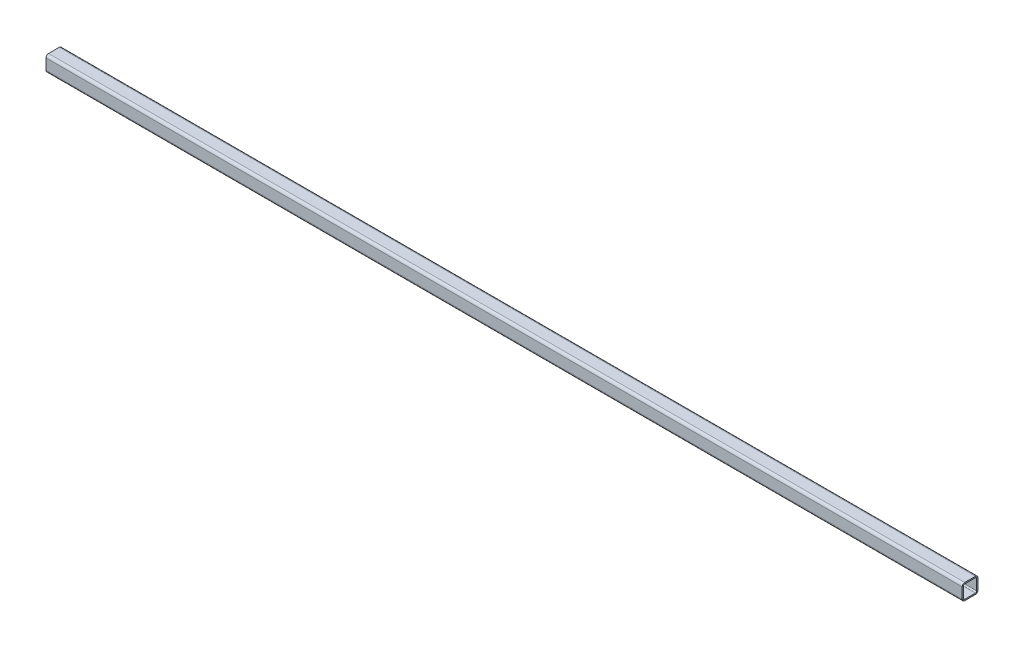
ISO-10303-21;
HEADER;
FILE_DESCRIPTION(('STEP AP214'),'2;1');
FILE_NAME('part.step','',(''),(''),'','','');
FILE_SCHEMA(('AUTOMOTIVE_DESIGN { 1 0 10303 214 1 1 1 1 }'));
ENDSEC;
DATA;
#1=APPLICATION_CONTEXT('core data for automotive mechanical design processes');
#2=APPLICATION_PROTOCOL_DEFINITION('international standard','automotive_design',2000,#1);
#3=PRODUCT_CONTEXT('',#1,'mechanical');
#4=PRODUCT('Part','Part','',(#3));
#5=PRODUCT_RELATED_PRODUCT_CATEGORY('part','',(#4));
#6=PRODUCT_DEFINITION_FORMATION('','',#4);
#7=PRODUCT_DEFINITION_CONTEXT('part definition',#1,'design');
#8=PRODUCT_DEFINITION('design','',#6,#7);
#9=PRODUCT_DEFINITION_SHAPE('','',#8);
#10=(LENGTH_UNIT() NAMED_UNIT(*) SI_UNIT(.MILLI.,.METRE.));
#11=(NAMED_UNIT(*) PLANE_ANGLE_UNIT() SI_UNIT($,.RADIAN.));
#12=(NAMED_UNIT(*) SI_UNIT($,.STERADIAN.) SOLID_ANGLE_UNIT());
#13=UNCERTAINTY_MEASURE_WITH_UNIT(LENGTH_MEASURE(1.E-05),#10,'distance_accuracy_value','');
#14=(GEOMETRIC_REPRESENTATION_CONTEXT(3) GLOBAL_UNCERTAINTY_ASSIGNED_CONTEXT((#13)) GLOBAL_UNIT_ASSIGNED_CONTEXT((#10,
#11,#12)) REPRESENTATION_CONTEXT('',''));
#15=CARTESIAN_POINT('',(0.,0.,0.));
#16=DIRECTION('',(0.,0.,1.));
#17=DIRECTION('',(1.,0.,0.));
#18=AXIS2_PLACEMENT_3D('',#15,#16,#17);
#19=CARTESIAN_POINT('',(-1180.,1563.6,-893.6));
#20=DIRECTION('',(1.,0.,0.));
#21=DIRECTION('',(0.,0.,-1.));
#22=AXIS2_PLACEMENT_3D('',#19,#20,#21);
#23=CYLINDRICAL_SURFACE('',#22,6.39999999999996);
#24=CARTESIAN_POINT('',(-1160.,1563.6,-893.6));
#25=DIRECTION('',(1.,0.,0.));
#26=DIRECTION('',(0.,0.,-1.));
#27=AXIS2_PLACEMENT_3D('',#24,#25,#26);
#28=CIRCLE('',#27,6.39999999999996);
#29=CARTESIAN_POINT('',(-1160.,1570.,-893.6));
#30=VERTEX_POINT('',#29);
#31=CARTESIAN_POINT('',(-1160.,1563.6,-900.));
#32=VERTEX_POINT('',#31);
#33=EDGE_CURVE('E151',#30,#32,#28,.F.);
#34=ORIENTED_EDGE('',*,*,#33,.F.);
#35=DIRECTION('',(1.,0.,0.));
#36=VECTOR('',#35,1.);
#37=CARTESIAN_POINT('',(-1180.,1570.,-893.6));
#38=LINE('',#37,#36);
#39=CARTESIAN_POINT('',(1160.,1570.,-893.6));
#40=VERTEX_POINT('',#39);
#41=EDGE_CURVE('E139',#30,#40,#38,.T.);
#42=ORIENTED_EDGE('',*,*,#41,.T.);
#43=CARTESIAN_POINT('',(1160.,1563.6,-893.6));
#44=DIRECTION('',(1.,0.,0.));
#45=DIRECTION('',(0.,0.,-1.));
#46=AXIS2_PLACEMENT_3D('',#43,#44,#45);
#47=CIRCLE('',#46,6.39999999999996);
#48=CARTESIAN_POINT('',(1160.,1563.6,-900.));
#49=VERTEX_POINT('',#48);
#50=EDGE_CURVE('E269',#49,#40,#47,.T.);
#51=ORIENTED_EDGE('',*,*,#50,.F.);
#52=DIRECTION('',(1.,0.,0.));
#53=VECTOR('',#52,1.);
#54=CARTESIAN_POINT('',(-1180.,1563.6,-900.));
#55=LINE('',#54,#53);
#56=EDGE_CURVE('E157',#49,#32,#55,.F.);
#57=ORIENTED_EDGE('',*,*,#56,.T.);
#58=EDGE_LOOP('',(#34,#42,#51,#57));
#59=FACE_BOUND('',#58,.T.);
#60=ADVANCED_FACE('F19',(#59),#23,.T.);
#61=CARTESIAN_POINT('',(-1180.,1570.,-866.4));
#62=DIRECTION('',(0.,-1.,0.));
#63=DIRECTION('',(0.,0.,-1.));
#64=AXIS2_PLACEMENT_3D('',#61,#62,#63);
#65=PLANE('',#64);
#66=DIRECTION('',(0.,0.,1.));
#67=VECTOR('',#66,1.);
#68=CARTESIAN_POINT('',(1160.,1570.,-893.6));
#69=LINE('',#68,#67);
#70=CARTESIAN_POINT('',(1160.,1570.,-866.4));
#71=VERTEX_POINT('',#70);
#72=EDGE_CURVE('E201',#40,#71,#69,.T.);
#73=ORIENTED_EDGE('',*,*,#72,.F.);
#74=ORIENTED_EDGE('',*,*,#41,.F.);
#75=DIRECTION('',(0.,0.,1.));
#76=VECTOR('',#75,1.);
#77=CARTESIAN_POINT('',(-1160.,1570.,-866.4));
#78=LINE('',#77,#76);
#79=CARTESIAN_POINT('',(-1160.,1570.,-866.4));
#80=VERTEX_POINT('',#79);
#81=EDGE_CURVE('E145',#80,#30,#78,.F.);
#82=ORIENTED_EDGE('',*,*,#81,.F.);
#83=DIRECTION('',(1.,0.,0.));
#84=VECTOR('',#83,1.);
#85=CARTESIAN_POINT('',(-1180.,1570.,-866.4));
#86=LINE('',#85,#84);
#87=EDGE_CURVE('E132',#71,#80,#86,.F.);
#88=ORIENTED_EDGE('',*,*,#87,.F.);
#89=EDGE_LOOP('',(#73,#74,#82,#88));
#90=FACE_BOUND('',#89,.T.);
#91=ADVANCED_FACE('F149',(#90),#65,.F.);
#92=CARTESIAN_POINT('',(-1180.,1563.6,-866.4));
#93=DIRECTION('',(1.,0.,0.));
#94=DIRECTION('',(0.,0.,-1.));
#95=AXIS2_PLACEMENT_3D('',#92,#93,#94);
#96=CYLINDRICAL_SURFACE('',#95,6.39999999999996);
#97=CARTESIAN_POINT('',(-1160.,1563.6,-866.4));
#98=DIRECTION('',(1.,0.,0.));
#99=DIRECTION('',(0.,0.,-1.));
#100=AXIS2_PLACEMENT_3D('',#97,#98,#99);
#101=CIRCLE('',#100,6.39999999999996);
#102=CARTESIAN_POINT('',(-1160.,1563.6,-860.));
#103=VERTEX_POINT('',#102);
#104=EDGE_CURVE('E22',#103,#80,#101,.F.);
#105=ORIENTED_EDGE('',*,*,#104,.F.);
#106=DIRECTION('',(1.,0.,0.));
#107=VECTOR('',#106,1.);
#108=CARTESIAN_POINT('',(-1180.,1563.6,-860.));
#109=LINE('',#108,#107);
#110=CARTESIAN_POINT('',(1160.,1563.6,-860.));
#111=VERTEX_POINT('',#110);
#112=EDGE_CURVE('E125',#103,#111,#109,.T.);
#113=ORIENTED_EDGE('',*,*,#112,.T.);
#114=CARTESIAN_POINT('',(1160.,1563.6,-866.4));
#115=DIRECTION('',(1.,0.,0.));
#116=DIRECTION('',(0.,0.,-1.));
#117=AXIS2_PLACEMENT_3D('',#114,#115,#116);
#118=CIRCLE('',#117,6.39999999999996);
#119=EDGE_CURVE('E135',#71,#111,#118,.T.);
#120=ORIENTED_EDGE('',*,*,#119,.F.);
#121=ORIENTED_EDGE('',*,*,#87,.T.);
#122=EDGE_LOOP('',(#105,#113,#120,#121));
#123=FACE_BOUND('',#122,.T.);
#124=ADVANCED_FACE('F134',(#123),#96,.T.);
#125=CARTESIAN_POINT('',(-1180.,1563.6,-860.));
#126=DIRECTION('',(0.,0.,-1.));
#127=DIRECTION('',(0.,1.,0.));
#128=AXIS2_PLACEMENT_3D('',#125,#126,#127);
#129=PLANE('',#128);
#130=DIRECTION('',(0.,1.,0.));
#131=VECTOR('',#130,1.);
#132=CARTESIAN_POINT('',(1160.,-1240.,-860.));
#133=LINE('',#132,#131);
#134=CARTESIAN_POINT('',(1160.,1536.4,-860.));
#135=VERTEX_POINT('',#134);
#136=EDGE_CURVE('E245',#111,#135,#133,.F.);
#137=ORIENTED_EDGE('',*,*,#136,.F.);
#138=ORIENTED_EDGE('',*,*,#112,.F.);
#139=DIRECTION('',(0.,1.,0.));
#140=VECTOR('',#139,1.);
#141=CARTESIAN_POINT('',(-1160.,-1240.,-860.));
#142=LINE('',#141,#140);
#143=CARTESIAN_POINT('',(-1160.,1536.4,-860.));
#144=VERTEX_POINT('',#143);
#145=EDGE_CURVE('E148',#144,#103,#142,.T.);
#146=ORIENTED_EDGE('',*,*,#145,.F.);
#147=DIRECTION('',(1.,0.,0.));
#148=VECTOR('',#147,1.);
#149=CARTESIAN_POINT('',(-1180.,1536.4,-860.));
#150=LINE('',#149,#148);
#151=EDGE_CURVE('E186',#135,#144,#150,.F.);
#152=ORIENTED_EDGE('',*,*,#151,.F.);
#153=EDGE_LOOP('',(#137,#138,#146,#152));
#154=FACE_BOUND('',#153,.T.);
#155=ADVANCED_FACE('F313',(#154),#129,.F.);
#156=CARTESIAN_POINT('',(-1180.,1566.8,-866.4));
#157=DIRECTION('',(0.,-1.,0.));
#158=DIRECTION('',(0.,0.,-1.));
#159=AXIS2_PLACEMENT_3D('',#156,#157,#158);
#160=PLANE('',#159);
#161=DIRECTION('',(1.,0.,0.));
#162=VECTOR('',#161,1.);
#163=CARTESIAN_POINT('',(-1180.,1566.8,-866.4));
#164=LINE('',#163,#162);
#165=CARTESIAN_POINT('',(1160.,1566.8,-866.4));
#166=VERTEX_POINT('',#165);
#167=CARTESIAN_POINT('',(-1160.,1566.8,-866.4));
#168=VERTEX_POINT('',#167);
#169=EDGE_CURVE('E166',#166,#168,#164,.F.);
#170=ORIENTED_EDGE('',*,*,#169,.T.);
#171=DIRECTION('',(0.,0.,1.));
#172=VECTOR('',#171,1.);
#173=CARTESIAN_POINT('',(-1160.,1566.8,-866.4));
#174=LINE('',#173,#172);
#175=CARTESIAN_POINT('',(-1160.,1566.8,-893.6));
#176=VERTEX_POINT('',#175);
#177=EDGE_CURVE('E216',#176,#168,#174,.T.);
#178=ORIENTED_EDGE('',*,*,#177,.F.);
#179=DIRECTION('',(1.,0.,0.));
#180=VECTOR('',#179,1.);
#181=CARTESIAN_POINT('',(-1180.,1566.8,-893.6));
#182=LINE('',#181,#180);
#183=CARTESIAN_POINT('',(1160.,1566.8,-893.6));
#184=VERTEX_POINT('',#183);
#185=EDGE_CURVE('E181',#176,#184,#182,.T.);
#186=ORIENTED_EDGE('',*,*,#185,.T.);
#187=DIRECTION('',(0.,0.,1.));
#188=VECTOR('',#187,1.);
#189=CARTESIAN_POINT('',(1160.,1566.8,-893.6));
#190=LINE('',#189,#188);
#191=EDGE_CURVE('E240',#166,#184,#190,.F.);
#192=ORIENTED_EDGE('',*,*,#191,.F.);
#193=EDGE_LOOP('',(#170,#178,#186,#192));
#194=FACE_BOUND('',#193,.T.);
#195=ADVANCED_FACE('F303',(#194),#160,.T.);
#196=CARTESIAN_POINT('',(-1180.,1563.6,-893.6));
#197=DIRECTION('',(1.,0.,0.));
#198=DIRECTION('',(0.,0.,-1.));
#199=AXIS2_PLACEMENT_3D('',#196,#197,#198);
#200=CYLINDRICAL_SURFACE('',#199,3.19999999999998);
#201=DIRECTION('',(1.,0.,0.));
#202=VECTOR('',#201,1.);
#203=CARTESIAN_POINT('',(-1180.,1563.6,-896.8));
#204=LINE('',#203,#202);
#205=CARTESIAN_POINT('',(1160.,1563.6,-896.8));
#206=VERTEX_POINT('',#205);
#207=CARTESIAN_POINT('',(-1160.,1563.6,-896.8));
#208=VERTEX_POINT('',#207);
#209=EDGE_CURVE('E179',#206,#208,#204,.F.);
#210=ORIENTED_EDGE('',*,*,#209,.F.);
#211=CARTESIAN_POINT('',(1160.,1563.6,-893.6));
#212=DIRECTION('',(1.,0.,0.));
#213=DIRECTION('',(0.,0.,-1.));
#214=AXIS2_PLACEMENT_3D('',#211,#212,#213);
#215=CIRCLE('',#214,3.19999999999998);
#216=EDGE_CURVE('E243',#184,#206,#215,.F.);
#217=ORIENTED_EDGE('',*,*,#216,.F.);
#218=ORIENTED_EDGE('',*,*,#185,.F.);
#219=CARTESIAN_POINT('',(-1160.,1563.6,-893.6));
#220=DIRECTION('',(1.,0.,0.));
#221=DIRECTION('',(0.,0.,-1.));
#222=AXIS2_PLACEMENT_3D('',#219,#220,#221);
#223=CIRCLE('',#222,3.19999999999998);
#224=EDGE_CURVE('E217',#208,#176,#223,.T.);
#225=ORIENTED_EDGE('',*,*,#224,.F.);
#226=EDGE_LOOP('',(#210,#217,#218,#225));
#227=FACE_BOUND('',#226,.T.);
#228=ADVANCED_FACE('F301',(#227),#200,.F.);
#229=CARTESIAN_POINT('',(-1180.,1536.4,-896.8));
#230=DIRECTION('',(0.,0.,1.));
#231=DIRECTION('',(0.,-1.,0.));
#232=AXIS2_PLACEMENT_3D('',#229,#230,#231);
#233=PLANE('',#232);
#234=ORIENTED_EDGE('',*,*,#209,.T.);
#235=DIRECTION('',(0.,1.,0.));
#236=VECTOR('',#235,1.);
#237=CARTESIAN_POINT('',(-1160.,-1240.,-896.8));
#238=LINE('',#237,#236);
#239=CARTESIAN_POINT('',(-1160.,1536.4,-896.8));
#240=VERTEX_POINT('',#239);
#241=EDGE_CURVE('E218',#240,#208,#238,.T.);
#242=ORIENTED_EDGE('',*,*,#241,.F.);
#243=DIRECTION('',(1.,0.,0.));
#244=VECTOR('',#243,1.);
#245=CARTESIAN_POINT('',(-1180.,1536.4,-896.8));
#246=LINE('',#245,#244);
#247=CARTESIAN_POINT('',(1160.,1536.4,-896.8));
#248=VERTEX_POINT('',#247);
#249=EDGE_CURVE('E176',#240,#248,#246,.T.);
#250=ORIENTED_EDGE('',*,*,#249,.T.);
#251=DIRECTION('',(0.,1.,0.));
#252=VECTOR('',#251,1.);
#253=CARTESIAN_POINT('',(1160.,-1240.,-896.8));
#254=LINE('',#253,#252);
#255=EDGE_CURVE('E259',#206,#248,#254,.F.);
#256=ORIENTED_EDGE('',*,*,#255,.F.);
#257=EDGE_LOOP('',(#234,#242,#250,#256));
#258=FACE_BOUND('',#257,.T.);
#259=ADVANCED_FACE('F299',(#258),#233,.T.);
#260=CARTESIAN_POINT('',(-1180.,1536.4,-893.6));
#261=DIRECTION('',(1.,0.,0.));
#262=DIRECTION('',(0.,0.,-1.));
#263=AXIS2_PLACEMENT_3D('',#260,#261,#262);
#264=CYLINDRICAL_SURFACE('',#263,3.19999999999987);
#265=DIRECTION('',(1.,0.,0.));
#266=VECTOR('',#265,1.);
#267=CARTESIAN_POINT('',(-1180.,1533.2,-893.6));
#268=LINE('',#267,#266);
#269=CARTESIAN_POINT('',(1160.,1533.2,-893.6));
#270=VERTEX_POINT('',#269);
#271=CARTESIAN_POINT('',(-1160.,1533.2,-893.6));
#272=VERTEX_POINT('',#271);
#273=EDGE_CURVE('E174',#270,#272,#268,.F.);
#274=ORIENTED_EDGE('',*,*,#273,.F.);
#275=CARTESIAN_POINT('',(1160.,1536.4,-893.6));
#276=DIRECTION('',(1.,0.,0.));
#277=DIRECTION('',(0.,0.,-1.));
#278=AXIS2_PLACEMENT_3D('',#275,#276,#277);
#279=CIRCLE('',#278,3.19999999999987);
#280=EDGE_CURVE('E258',#248,#270,#279,.F.);
#281=ORIENTED_EDGE('',*,*,#280,.F.);
#282=ORIENTED_EDGE('',*,*,#249,.F.);
#283=CARTESIAN_POINT('',(-1160.,1536.4,-893.6));
#284=DIRECTION('',(1.,0.,0.));
#285=DIRECTION('',(0.,0.,-1.));
#286=AXIS2_PLACEMENT_3D('',#283,#284,#285);
#287=CIRCLE('',#286,3.19999999999987);
#288=EDGE_CURVE('E189',#272,#240,#287,.T.);
#289=ORIENTED_EDGE('',*,*,#288,.F.);
#290=EDGE_LOOP('',(#274,#281,#282,#289));
#291=FACE_BOUND('',#290,.T.);
#292=ADVANCED_FACE('F297',(#291),#264,.F.);
#293=CARTESIAN_POINT('',(-1180.,1533.2,-893.6));
#294=DIRECTION('',(0.,1.,0.));
#295=DIRECTION('',(0.,0.,1.));
#296=AXIS2_PLACEMENT_3D('',#293,#294,#295);
#297=PLANE('',#296);
#298=ORIENTED_EDGE('',*,*,#273,.T.);
#299=DIRECTION('',(0.,0.,1.));
#300=VECTOR('',#299,1.);
#301=CARTESIAN_POINT('',(-1160.,1533.2,-866.4));
#302=LINE('',#301,#300);
#303=CARTESIAN_POINT('',(-1160.,1533.2,-866.4));
#304=VERTEX_POINT('',#303);
#305=EDGE_CURVE('E208',#304,#272,#302,.F.);
#306=ORIENTED_EDGE('',*,*,#305,.F.);
#307=DIRECTION('',(1.,0.,0.));
#308=VECTOR('',#307,1.);
#309=CARTESIAN_POINT('',(-1180.,1533.2,-866.4));
#310=LINE('',#309,#308);
#311=CARTESIAN_POINT('',(1160.,1533.2,-866.4));
#312=VERTEX_POINT('',#311);
#313=EDGE_CURVE('E171',#304,#312,#310,.T.);
#314=ORIENTED_EDGE('',*,*,#313,.T.);
#315=DIRECTION('',(0.,0.,1.));
#316=VECTOR('',#315,1.);
#317=CARTESIAN_POINT('',(1160.,1533.2,-893.6));
#318=LINE('',#317,#316);
#319=EDGE_CURVE('E257',#270,#312,#318,.T.);
#320=ORIENTED_EDGE('',*,*,#319,.F.);
#321=EDGE_LOOP('',(#298,#306,#314,#320));
#322=FACE_BOUND('',#321,.T.);
#323=ADVANCED_FACE('F292',(#322),#297,.T.);
#324=CARTESIAN_POINT('',(-1180.,1536.4,-866.4));
#325=DIRECTION('',(1.,0.,0.));
#326=DIRECTION('',(0.,0.,-1.));
#327=AXIS2_PLACEMENT_3D('',#324,#325,#326);
#328=CYLINDRICAL_SURFACE('',#327,3.19999999999987);
#329=DIRECTION('',(1.,0.,0.));
#330=VECTOR('',#329,1.);
#331=CARTESIAN_POINT('',(-1180.,1536.4,-863.2));
#332=LINE('',#331,#330);
#333=CARTESIAN_POINT('',(1160.,1536.4,-863.2));
#334=VERTEX_POINT('',#333);
#335=CARTESIAN_POINT('',(-1160.,1536.4,-863.2));
#336=VERTEX_POINT('',#335);
#337=EDGE_CURVE('E167',#334,#336,#332,.F.);
#338=ORIENTED_EDGE('',*,*,#337,.F.);
#339=CARTESIAN_POINT('',(1160.,1536.4,-866.4));
#340=DIRECTION('',(1.,0.,0.));
#341=DIRECTION('',(0.,0.,-1.));
#342=AXIS2_PLACEMENT_3D('',#339,#340,#341);
#343=CIRCLE('',#342,3.19999999999987);
#344=EDGE_CURVE('E256',#312,#334,#343,.F.);
#345=ORIENTED_EDGE('',*,*,#344,.F.);
#346=ORIENTED_EDGE('',*,*,#313,.F.);
#347=CARTESIAN_POINT('',(-1160.,1536.4,-866.4));
#348=DIRECTION('',(1.,0.,0.));
#349=DIRECTION('',(0.,0.,-1.));
#350=AXIS2_PLACEMENT_3D('',#347,#348,#349);
#351=CIRCLE('',#350,3.19999999999987);
#352=EDGE_CURVE('E211',#336,#304,#351,.T.);
#353=ORIENTED_EDGE('',*,*,#352,.F.);
#354=EDGE_LOOP('',(#338,#345,#346,#353));
#355=FACE_BOUND('',#354,.T.);
#356=ADVANCED_FACE('F288',(#355),#328,.F.);
#357=CARTESIAN_POINT('',(-1180.,1563.6,-863.2));
#358=DIRECTION('',(0.,0.,-1.));
#359=DIRECTION('',(0.,1.,0.));
#360=AXIS2_PLACEMENT_3D('',#357,#358,#359);
#361=PLANE('',#360);
#362=ORIENTED_EDGE('',*,*,#337,.T.);
#363=DIRECTION('',(0.,1.,0.));
#364=VECTOR('',#363,1.);
#365=CARTESIAN_POINT('',(-1160.,-1240.,-863.2));
#366=LINE('',#365,#364);
#367=CARTESIAN_POINT('',(-1160.,1563.6,-863.2));
#368=VERTEX_POINT('',#367);
#369=EDGE_CURVE('E212',#368,#336,#366,.F.);
#370=ORIENTED_EDGE('',*,*,#369,.F.);
#371=DIRECTION('',(1.,0.,0.));
#372=VECTOR('',#371,1.);
#373=CARTESIAN_POINT('',(-1180.,1563.6,-863.2));
#374=LINE('',#373,#372);
#375=CARTESIAN_POINT('',(1160.,1563.6,-863.2));
#376=VERTEX_POINT('',#375);
#377=EDGE_CURVE('E163',#368,#376,#374,.T.);
#378=ORIENTED_EDGE('',*,*,#377,.T.);
#379=DIRECTION('',(0.,1.,0.));
#380=VECTOR('',#379,1.);
#381=CARTESIAN_POINT('',(1160.,-1240.,-863.2));
#382=LINE('',#381,#380);
#383=EDGE_CURVE('E252',#334,#376,#382,.T.);
#384=ORIENTED_EDGE('',*,*,#383,.F.);
#385=EDGE_LOOP('',(#362,#370,#378,#384));
#386=FACE_BOUND('',#385,.T.);
#387=ADVANCED_FACE('F282',(#386),#361,.T.);
#388=CARTESIAN_POINT('',(-1180.,1563.6,-866.4));
#389=DIRECTION('',(1.,0.,0.));
#390=DIRECTION('',(0.,0.,-1.));
#391=AXIS2_PLACEMENT_3D('',#388,#389,#390);
#392=CYLINDRICAL_SURFACE('',#391,3.19999999999987);
#393=ORIENTED_EDGE('',*,*,#169,.F.);
#394=CARTESIAN_POINT('',(1160.,1563.6,-866.4));
#395=DIRECTION('',(1.,0.,0.));
#396=DIRECTION('',(0.,0.,-1.));
#397=AXIS2_PLACEMENT_3D('',#394,#395,#396);
#398=CIRCLE('',#397,3.19999999999987);
#399=EDGE_CURVE('E255',#376,#166,#398,.F.);
#400=ORIENTED_EDGE('',*,*,#399,.F.);
#401=ORIENTED_EDGE('',*,*,#377,.F.);
#402=CARTESIAN_POINT('',(-1160.,1563.6,-866.4));
#403=DIRECTION('',(1.,0.,0.));
#404=DIRECTION('',(0.,0.,-1.));
#405=AXIS2_PLACEMENT_3D('',#402,#403,#404);
#406=CIRCLE('',#405,3.19999999999987);
#407=EDGE_CURVE('E215',#168,#368,#406,.T.);
#408=ORIENTED_EDGE('',*,*,#407,.F.);
#409=EDGE_LOOP('',(#393,#400,#401,#408));
#410=FACE_BOUND('',#409,.T.);
#411=ADVANCED_FACE('F306',(#410),#392,.F.);
#412=CARTESIAN_POINT('',(-1180.,1536.4,-900.));
#413=DIRECTION('',(0.,0.,1.));
#414=DIRECTION('',(0.,-1.,0.));
#415=AXIS2_PLACEMENT_3D('',#412,#413,#414);
#416=PLANE('',#415);
#417=DIRECTION('',(0.,1.,0.));
#418=VECTOR('',#417,1.);
#419=CARTESIAN_POINT('',(1160.,-1240.,-900.));
#420=LINE('',#419,#418);
#421=CARTESIAN_POINT('',(1160.,1536.4,-900.));
#422=VERTEX_POINT('',#421);
#423=EDGE_CURVE('E237',#422,#49,#420,.T.);
#424=ORIENTED_EDGE('',*,*,#423,.F.);
#425=DIRECTION('',(1.,0.,0.));
#426=VECTOR('',#425,1.);
#427=CARTESIAN_POINT('',(-1180.,1536.4,-900.));
#428=LINE('',#427,#426);
#429=CARTESIAN_POINT('',(-1160.,1536.4,-900.));
#430=VERTEX_POINT('',#429);
#431=EDGE_CURVE('E158',#430,#422,#428,.T.);
#432=ORIENTED_EDGE('',*,*,#431,.F.);
#433=DIRECTION('',(0.,1.,0.));
#434=VECTOR('',#433,1.);
#435=CARTESIAN_POINT('',(-1160.,-1240.,-900.));
#436=LINE('',#435,#434);
#437=EDGE_CURVE('E153',#32,#430,#436,.F.);
#438=ORIENTED_EDGE('',*,*,#437,.F.);
#439=ORIENTED_EDGE('',*,*,#56,.F.);
#440=EDGE_LOOP('',(#424,#432,#438,#439));
#441=FACE_BOUND('',#440,.T.);
#442=ADVANCED_FACE('F235',(#441),#416,.F.);
#443=CARTESIAN_POINT('',(-1160.,-1240.,-866.4));
#444=DIRECTION('',(-1.,0.,0.));
#445=DIRECTION('',(0.,0.,1.));
#446=AXIS2_PLACEMENT_3D('',#443,#444,#445);
#447=PLANE('',#446);
#448=ORIENTED_EDGE('',*,*,#305,.T.);
#449=ORIENTED_EDGE('',*,*,#288,.T.);
#450=ORIENTED_EDGE('',*,*,#241,.T.);
#451=ORIENTED_EDGE('',*,*,#224,.T.);
#452=ORIENTED_EDGE('',*,*,#177,.T.);
#453=ORIENTED_EDGE('',*,*,#407,.T.);
#454=ORIENTED_EDGE('',*,*,#369,.T.);
#455=ORIENTED_EDGE('',*,*,#352,.T.);
#456=EDGE_LOOP('',(#448,#449,#450,#451,#452,#453,#454,#455));
#457=FACE_BOUND('',#456,.T.);
#458=CARTESIAN_POINT('',(-1160.,1536.4,-893.6));
#459=DIRECTION('',(1.,0.,0.));
#460=DIRECTION('',(0.,0.,-1.));
#461=AXIS2_PLACEMENT_3D('',#458,#459,#460);
#462=CIRCLE('',#461,6.39999999999996);
#463=CARTESIAN_POINT('',(-1160.,1530.,-893.6));
#464=VERTEX_POINT('',#463);
#465=EDGE_CURVE('E162',#464,#430,#462,.T.);
#466=ORIENTED_EDGE('',*,*,#465,.F.);
#467=DIRECTION('',(0.,0.,1.));
#468=VECTOR('',#467,1.);
#469=CARTESIAN_POINT('',(-1160.,1530.,-893.6));
#470=LINE('',#469,#468);
#471=CARTESIAN_POINT('',(-1160.,1530.,-866.4));
#472=VERTEX_POINT('',#471);
#473=EDGE_CURVE('E161',#464,#472,#470,.T.);
#474=ORIENTED_EDGE('',*,*,#473,.T.);
#475=CARTESIAN_POINT('',(-1160.,1536.4,-866.4));
#476=DIRECTION('',(1.,0.,0.));
#477=DIRECTION('',(0.,0.,-1.));
#478=AXIS2_PLACEMENT_3D('',#475,#476,#477);
#479=CIRCLE('',#478,6.39999999999996);
#480=EDGE_CURVE('E188',#144,#472,#479,.T.);
#481=ORIENTED_EDGE('',*,*,#480,.F.);
#482=ORIENTED_EDGE('',*,*,#145,.T.);
#483=ORIENTED_EDGE('',*,*,#104,.T.);
#484=ORIENTED_EDGE('',*,*,#81,.T.);
#485=ORIENTED_EDGE('',*,*,#33,.T.);
#486=ORIENTED_EDGE('',*,*,#437,.T.);
#487=EDGE_LOOP('',(#466,#474,#481,#482,#483,#484,#485,#486));
#488=FACE_BOUND('',#487,.T.);
#489=ADVANCED_FACE('F144',(#457,#488),#447,.T.);
#490=CARTESIAN_POINT('',(-1180.,1536.4,-866.4));
#491=DIRECTION('',(1.,0.,0.));
#492=DIRECTION('',(0.,0.,-1.));
#493=AXIS2_PLACEMENT_3D('',#490,#491,#492);
#494=CYLINDRICAL_SURFACE('',#493,6.39999999999996);
#495=ORIENTED_EDGE('',*,*,#480,.T.);
#496=DIRECTION('',(1.,0.,0.));
#497=VECTOR('',#496,1.);
#498=CARTESIAN_POINT('',(-1180.,1530.,-866.4));
#499=LINE('',#498,#497);
#500=CARTESIAN_POINT('',(1160.,1530.,-866.4));
#501=VERTEX_POINT('',#500);
#502=EDGE_CURVE('E196',#472,#501,#499,.T.);
#503=ORIENTED_EDGE('',*,*,#502,.T.);
#504=CARTESIAN_POINT('',(1160.,1536.4,-866.4));
#505=DIRECTION('',(1.,0.,0.));
#506=DIRECTION('',(0.,0.,-1.));
#507=AXIS2_PLACEMENT_3D('',#504,#505,#506);
#508=CIRCLE('',#507,6.39999999999996);
#509=EDGE_CURVE('E241',#135,#501,#508,.T.);
#510=ORIENTED_EDGE('',*,*,#509,.F.);
#511=ORIENTED_EDGE('',*,*,#151,.T.);
#512=EDGE_LOOP('',(#495,#503,#510,#511));
#513=FACE_BOUND('',#512,.T.);
#514=ADVANCED_FACE('F316',(#513),#494,.T.);
#515=CARTESIAN_POINT('',(1160.,-1240.,-893.6));
#516=DIRECTION('',(1.,0.,0.));
#517=DIRECTION('',(0.,1.,0.));
#518=AXIS2_PLACEMENT_3D('',#515,#516,#517);
#519=PLANE('',#518);
#520=ORIENTED_EDGE('',*,*,#383,.T.);
#521=ORIENTED_EDGE('',*,*,#399,.T.);
#522=ORIENTED_EDGE('',*,*,#191,.T.);
#523=ORIENTED_EDGE('',*,*,#216,.T.);
#524=ORIENTED_EDGE('',*,*,#255,.T.);
#525=ORIENTED_EDGE('',*,*,#280,.T.);
#526=ORIENTED_EDGE('',*,*,#319,.T.);
#527=ORIENTED_EDGE('',*,*,#344,.T.);
#528=EDGE_LOOP('',(#520,#521,#522,#523,#524,#525,#526,#527));
#529=FACE_BOUND('',#528,.T.);
#530=CARTESIAN_POINT('',(1160.,1536.4,-893.6));
#531=DIRECTION('',(1.,0.,0.));
#532=DIRECTION('',(0.,0.,-1.));
#533=AXIS2_PLACEMENT_3D('',#530,#531,#532);
#534=CIRCLE('',#533,6.39999999999996);
#535=CARTESIAN_POINT('',(1160.,1530.,-893.6));
#536=VERTEX_POINT('',#535);
#537=EDGE_CURVE('E36',#422,#536,#534,.F.);
#538=ORIENTED_EDGE('',*,*,#537,.F.);
#539=ORIENTED_EDGE('',*,*,#423,.T.);
#540=ORIENTED_EDGE('',*,*,#50,.T.);
#541=ORIENTED_EDGE('',*,*,#72,.T.);
#542=ORIENTED_EDGE('',*,*,#119,.T.);
#543=ORIENTED_EDGE('',*,*,#136,.T.);
#544=ORIENTED_EDGE('',*,*,#509,.T.);
#545=DIRECTION('',(0.,0.,1.));
#546=VECTOR('',#545,1.);
#547=CARTESIAN_POINT('',(1160.,1530.,-893.6));
#548=LINE('',#547,#546);
#549=EDGE_CURVE('E28',#501,#536,#548,.F.);
#550=ORIENTED_EDGE('',*,*,#549,.T.);
#551=EDGE_LOOP('',(#538,#539,#540,#541,#542,#543,#544,#550));
#552=FACE_BOUND('',#551,.T.);
#553=ADVANCED_FACE('F307',(#529,#552),#519,.T.);
#554=CARTESIAN_POINT('',(-1180.,1536.4,-893.6));
#555=DIRECTION('',(1.,0.,0.));
#556=DIRECTION('',(0.,0.,-1.));
#557=AXIS2_PLACEMENT_3D('',#554,#555,#556);
#558=CYLINDRICAL_SURFACE('',#557,6.39999999999996);
#559=ORIENTED_EDGE('',*,*,#465,.T.);
#560=ORIENTED_EDGE('',*,*,#431,.T.);
#561=ORIENTED_EDGE('',*,*,#537,.T.);
#562=DIRECTION('',(1.,0.,0.));
#563=VECTOR('',#562,1.);
#564=CARTESIAN_POINT('',(-1180.,1530.,-893.6));
#565=LINE('',#564,#563);
#566=EDGE_CURVE('E12',#536,#464,#565,.F.);
#567=ORIENTED_EDGE('',*,*,#566,.T.);
#568=EDGE_LOOP('',(#559,#560,#561,#567));
#569=FACE_BOUND('',#568,.T.);
#570=ADVANCED_FACE('F232',(#569),#558,.T.);
#571=CARTESIAN_POINT('',(-1180.,1530.,-893.6));
#572=DIRECTION('',(0.,1.,0.));
#573=DIRECTION('',(0.,0.,1.));
#574=AXIS2_PLACEMENT_3D('',#571,#572,#573);
#575=PLANE('',#574);
#576=ORIENTED_EDGE('',*,*,#549,.F.);
#577=ORIENTED_EDGE('',*,*,#502,.F.);
#578=ORIENTED_EDGE('',*,*,#473,.F.);
#579=ORIENTED_EDGE('',*,*,#566,.F.);
#580=EDGE_LOOP('',(#576,#577,#578,#579));
#581=FACE_BOUND('',#580,.T.);
#582=ADVANCED_FACE('F320',(#581),#575,.F.);
#583=CLOSED_SHELL('',(#60,#91,#124,#155,#195,#228,#259,#292,#323,#356,#387,#411,#442,#489,#514,
#553,#570,#582));
#584=MANIFOLD_SOLID_BREP('B1',#583);
#585=ADVANCED_BREP_SHAPE_REPRESENTATION('',(#18,#584),#14);
#586=SHAPE_DEFINITION_REPRESENTATION(#9,#585);
ENDSEC;
END-ISO-10303-21;
